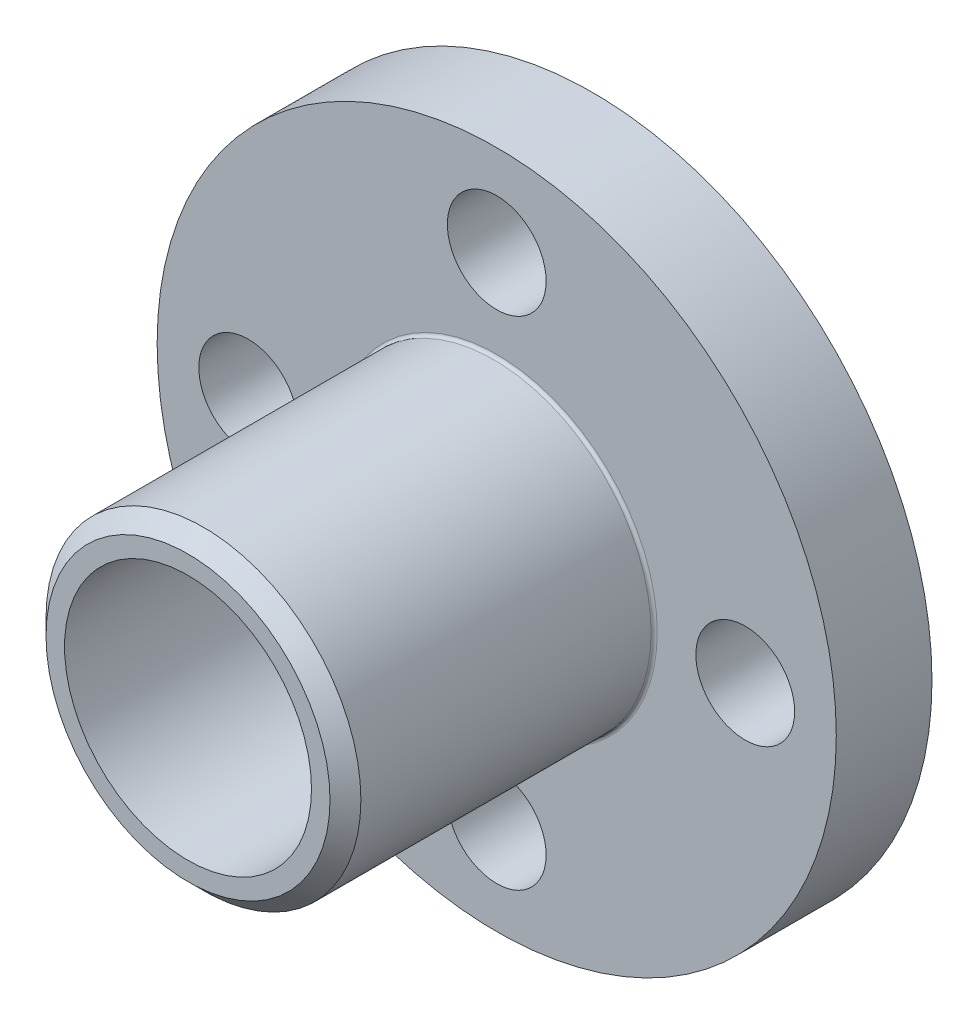
ISO-10303-21;
HEADER;
FILE_DESCRIPTION(('STEP AP214'),'2;1');
FILE_NAME('part.step','',(''),(''),'','','');
FILE_SCHEMA(('AUTOMOTIVE_DESIGN { 1 0 10303 214 1 1 1 1 }'));
ENDSEC;
DATA;
#1=APPLICATION_CONTEXT('core data for automotive mechanical design processes');
#2=APPLICATION_PROTOCOL_DEFINITION('international standard','automotive_design',2000,#1);
#3=PRODUCT_CONTEXT('',#1,'mechanical');
#4=PRODUCT('Part','Part','',(#3));
#5=PRODUCT_RELATED_PRODUCT_CATEGORY('part','',(#4));
#6=PRODUCT_DEFINITION_FORMATION('','',#4);
#7=PRODUCT_DEFINITION_CONTEXT('part definition',#1,'design');
#8=PRODUCT_DEFINITION('design','',#6,#7);
#9=PRODUCT_DEFINITION_SHAPE('','',#8);
#10=(LENGTH_UNIT() NAMED_UNIT(*) SI_UNIT(.MILLI.,.METRE.));
#11=(NAMED_UNIT(*) PLANE_ANGLE_UNIT() SI_UNIT($,.RADIAN.));
#12=(NAMED_UNIT(*) SI_UNIT($,.STERADIAN.) SOLID_ANGLE_UNIT());
#13=UNCERTAINTY_MEASURE_WITH_UNIT(LENGTH_MEASURE(1.E-05),#10,'distance_accuracy_value','');
#14=(GEOMETRIC_REPRESENTATION_CONTEXT(3) GLOBAL_UNCERTAINTY_ASSIGNED_CONTEXT((#13)) GLOBAL_UNIT_ASSIGNED_CONTEXT((#10,
#11,#12)) REPRESENTATION_CONTEXT('',''));
#15=CARTESIAN_POINT('',(0.,0.,0.));
#16=DIRECTION('',(0.,0.,1.));
#17=DIRECTION('',(1.,0.,0.));
#18=AXIS2_PLACEMENT_3D('',#15,#16,#17);
#19=CARTESIAN_POINT('',(0.,0.,3.1));
#20=DIRECTION('',(0.,0.,1.));
#21=DIRECTION('',(1.,0.,0.));
#22=AXIS2_PLACEMENT_3D('',#19,#20,#21);
#23=PLANE('',#22);
#24=CARTESIAN_POINT('',(0.,8.05,3.1));
#25=DIRECTION('',(0.,0.,1.));
#26=DIRECTION('',(1.,0.,0.));
#27=AXIS2_PLACEMENT_3D('',#24,#25,#26);
#28=CIRCLE('',#27,1.6);
#29=CARTESIAN_POINT('',(1.6,8.05,3.1));
#30=VERTEX_POINT('',#29);
#31=EDGE_CURVE('E51',#30,#30,#28,.T.);
#32=ORIENTED_EDGE('',*,*,#31,.F.);
#33=EDGE_LOOP('',(#32));
#34=FACE_BOUND('',#33,.T.);
#35=CARTESIAN_POINT('',(8.05,0.,3.1));
#36=DIRECTION('',(0.,0.,1.));
#37=DIRECTION('',(1.,0.,0.));
#38=AXIS2_PLACEMENT_3D('',#35,#36,#37);
#39=CIRCLE('',#38,1.6);
#40=CARTESIAN_POINT('',(9.65,0.,3.1));
#41=VERTEX_POINT('',#40);
#42=EDGE_CURVE('E158',#41,#41,#39,.T.);
#43=ORIENTED_EDGE('',*,*,#42,.F.);
#44=EDGE_LOOP('',(#43));
#45=FACE_BOUND('',#44,.T.);
#46=CARTESIAN_POINT('',(0.,-8.05,3.1));
#47=DIRECTION('',(0.,0.,1.));
#48=DIRECTION('',(1.,0.,0.));
#49=AXIS2_PLACEMENT_3D('',#46,#47,#48);
#50=CIRCLE('',#49,1.6);
#51=CARTESIAN_POINT('',(1.6,-8.05,3.1));
#52=VERTEX_POINT('',#51);
#53=EDGE_CURVE('E161',#52,#52,#50,.T.);
#54=ORIENTED_EDGE('',*,*,#53,.F.);
#55=EDGE_LOOP('',(#54));
#56=FACE_BOUND('',#55,.T.);
#57=CARTESIAN_POINT('',(-8.05,0.,3.1));
#58=DIRECTION('',(0.,0.,1.));
#59=DIRECTION('',(1.,0.,0.));
#60=AXIS2_PLACEMENT_3D('',#57,#58,#59);
#61=CIRCLE('',#60,1.6);
#62=CARTESIAN_POINT('',(-6.45,0.,3.1));
#63=VERTEX_POINT('',#62);
#64=EDGE_CURVE('E70',#63,#63,#61,.T.);
#65=ORIENTED_EDGE('',*,*,#64,.F.);
#66=EDGE_LOOP('',(#65));
#67=FACE_BOUND('',#66,.T.);
#68=CARTESIAN_POINT('',(0.,0.,3.1));
#69=DIRECTION('',(0.,0.,1.));
#70=DIRECTION('',(1.,0.,0.));
#71=AXIS2_PLACEMENT_3D('',#68,#69,#70);
#72=CIRCLE('',#71,5.2);
#73=CARTESIAN_POINT('',(5.2,0.,3.1));
#74=VERTEX_POINT('',#73);
#75=EDGE_CURVE('E10',#74,#74,#72,.F.);
#76=ORIENTED_EDGE('',*,*,#75,.T.);
#77=EDGE_LOOP('',(#76));
#78=FACE_BOUND('',#77,.T.);
#79=CARTESIAN_POINT('',(0.,0.,3.1));
#80=DIRECTION('',(0.,0.,1.));
#81=DIRECTION('',(1.,0.,0.));
#82=AXIS2_PLACEMENT_3D('',#79,#80,#81);
#83=CIRCLE('',#82,11.);
#84=CARTESIAN_POINT('',(-11.,0.,3.1));
#85=VERTEX_POINT('',#84);
#86=EDGE_CURVE('E73',#85,#85,#83,.T.);
#87=ORIENTED_EDGE('',*,*,#86,.T.);
#88=EDGE_LOOP('',(#87));
#89=FACE_BOUND('',#88,.T.);
#90=ADVANCED_FACE('F30',(#34,#45,#56,#67,#78,#89),#23,.T.);
#91=CARTESIAN_POINT('',(0.,0.,0.));
#92=DIRECTION('',(0.,0.,1.));
#93=DIRECTION('',(1.,0.,0.));
#94=AXIS2_PLACEMENT_3D('',#91,#92,#93);
#95=PLANE('',#94);
#96=CARTESIAN_POINT('',(0.,8.05,0.));
#97=DIRECTION('',(0.,0.,1.));
#98=DIRECTION('',(1.,0.,0.));
#99=AXIS2_PLACEMENT_3D('',#96,#97,#98);
#100=CIRCLE('',#99,1.6);
#101=CARTESIAN_POINT('',(1.6,8.05,0.));
#102=VERTEX_POINT('',#101);
#103=EDGE_CURVE('E34',#102,#102,#100,.T.);
#104=ORIENTED_EDGE('',*,*,#103,.T.);
#105=EDGE_LOOP('',(#104));
#106=FACE_BOUND('',#105,.T.);
#107=CARTESIAN_POINT('',(8.05,0.,0.));
#108=DIRECTION('',(0.,0.,1.));
#109=DIRECTION('',(1.,0.,0.));
#110=AXIS2_PLACEMENT_3D('',#107,#108,#109);
#111=CIRCLE('',#110,1.6);
#112=CARTESIAN_POINT('',(9.65,0.,0.));
#113=VERTEX_POINT('',#112);
#114=EDGE_CURVE('E53',#113,#113,#111,.T.);
#115=ORIENTED_EDGE('',*,*,#114,.T.);
#116=EDGE_LOOP('',(#115));
#117=FACE_BOUND('',#116,.T.);
#118=CARTESIAN_POINT('',(0.,-8.05,0.));
#119=DIRECTION('',(0.,0.,1.));
#120=DIRECTION('',(1.,0.,0.));
#121=AXIS2_PLACEMENT_3D('',#118,#119,#120);
#122=CIRCLE('',#121,1.6);
#123=CARTESIAN_POINT('',(1.6,-8.05,0.));
#124=VERTEX_POINT('',#123);
#125=EDGE_CURVE('E50',#124,#124,#122,.T.);
#126=ORIENTED_EDGE('',*,*,#125,.T.);
#127=EDGE_LOOP('',(#126));
#128=FACE_BOUND('',#127,.T.);
#129=CARTESIAN_POINT('',(-8.05,0.,0.));
#130=DIRECTION('',(0.,0.,1.));
#131=DIRECTION('',(1.,0.,0.));
#132=AXIS2_PLACEMENT_3D('',#129,#130,#131);
#133=CIRCLE('',#132,1.6);
#134=CARTESIAN_POINT('',(-6.45,0.,0.));
#135=VERTEX_POINT('',#134);
#136=EDGE_CURVE('E47',#135,#135,#133,.T.);
#137=ORIENTED_EDGE('',*,*,#136,.T.);
#138=EDGE_LOOP('',(#137));
#139=FACE_BOUND('',#138,.T.);
#140=CARTESIAN_POINT('',(0.,0.,0.));
#141=DIRECTION('',(0.,0.,1.));
#142=DIRECTION('',(1.,0.,0.));
#143=AXIS2_PLACEMENT_3D('',#140,#141,#142);
#144=CIRCLE('',#143,11.);
#145=CARTESIAN_POINT('',(-11.,0.,0.));
#146=VERTEX_POINT('',#145);
#147=EDGE_CURVE('E67',#146,#146,#144,.T.);
#148=ORIENTED_EDGE('',*,*,#147,.F.);
#149=EDGE_LOOP('',(#148));
#150=FACE_BOUND('',#149,.T.);
#151=CARTESIAN_POINT('',(0.,0.,0.));
#152=DIRECTION('',(0.,0.,1.));
#153=DIRECTION('',(1.,0.,0.));
#154=AXIS2_PLACEMENT_3D('',#151,#152,#153);
#155=CIRCLE('',#154,4.);
#156=CARTESIAN_POINT('',(4.,0.,0.));
#157=VERTEX_POINT('',#156);
#158=EDGE_CURVE('E62',#157,#157,#155,.T.);
#159=ORIENTED_EDGE('',*,*,#158,.T.);
#160=EDGE_LOOP('',(#159));
#161=FACE_BOUND('',#160,.T.);
#162=ADVANCED_FACE('F102',(#106,#117,#128,#139,#150,#161),#95,.F.);
#163=CARTESIAN_POINT('',(0.,0.,3.1));
#164=DIRECTION('',(0.,0.,-1.));
#165=DIRECTION('',(-1.,0.,0.));
#166=AXIS2_PLACEMENT_3D('',#163,#164,#165);
#167=CYLINDRICAL_SURFACE('',#166,11.);
#168=CARTESIAN_POINT('',(-11.,0.,3.1));
#169=CARTESIAN_POINT('',(-11.,0.,3.06770833333333));
#170=CARTESIAN_POINT('',(-11.,0.,3.03541666666667));
#171=CARTESIAN_POINT('',(-11.,0.,2.97083333333333));
#172=CARTESIAN_POINT('',(-11.,0.,2.93854166666667));
#173=CARTESIAN_POINT('',(-11.,0.,2.87395833333333));
#174=CARTESIAN_POINT('',(-11.,0.,2.84166666666667));
#175=CARTESIAN_POINT('',(-11.,0.,2.77708333333333));
#176=CARTESIAN_POINT('',(-11.,0.,2.74479166666667));
#177=CARTESIAN_POINT('',(-11.,0.,2.68020833333333));
#178=CARTESIAN_POINT('',(-11.,0.,2.64791666666667));
#179=CARTESIAN_POINT('',(-11.,0.,2.58333333333333));
#180=CARTESIAN_POINT('',(-11.,0.,2.55104166666667));
#181=CARTESIAN_POINT('',(-11.,0.,2.48645833333333));
#182=CARTESIAN_POINT('',(-11.,0.,2.45416666666667));
#183=CARTESIAN_POINT('',(-11.,0.,2.38958333333333));
#184=CARTESIAN_POINT('',(-11.,0.,2.35729166666667));
#185=CARTESIAN_POINT('',(-11.,0.,2.29270833333333));
#186=CARTESIAN_POINT('',(-11.,0.,2.26041666666667));
#187=CARTESIAN_POINT('',(-11.,0.,2.19583333333333));
#188=CARTESIAN_POINT('',(-11.,0.,2.16354166666667));
#189=CARTESIAN_POINT('',(-11.,0.,2.09895833333333));
#190=CARTESIAN_POINT('',(-11.,0.,2.06666666666667));
#191=CARTESIAN_POINT('',(-11.,0.,2.00208333333333));
#192=CARTESIAN_POINT('',(-11.,0.,1.96979166666667));
#193=CARTESIAN_POINT('',(-11.,0.,1.90520833333333));
#194=CARTESIAN_POINT('',(-11.,0.,1.87291666666667));
#195=CARTESIAN_POINT('',(-11.,0.,1.80833333333333));
#196=CARTESIAN_POINT('',(-11.,0.,1.77604166666667));
#197=CARTESIAN_POINT('',(-11.,0.,1.71145833333333));
#198=CARTESIAN_POINT('',(-11.,0.,1.67916666666667));
#199=CARTESIAN_POINT('',(-11.,0.,1.61458333333333));
#200=CARTESIAN_POINT('',(-11.,0.,1.58229166666667));
#201=CARTESIAN_POINT('',(-11.,0.,1.51770833333333));
#202=CARTESIAN_POINT('',(-11.,0.,1.48541666666667));
#203=CARTESIAN_POINT('',(-11.,0.,1.42083333333333));
#204=CARTESIAN_POINT('',(-11.,0.,1.38854166666667));
#205=CARTESIAN_POINT('',(-11.,0.,1.32395833333333));
#206=CARTESIAN_POINT('',(-11.,0.,1.29166666666667));
#207=CARTESIAN_POINT('',(-11.,0.,1.22708333333333));
#208=CARTESIAN_POINT('',(-11.,0.,1.19479166666667));
#209=CARTESIAN_POINT('',(-11.,0.,1.13020833333333));
#210=CARTESIAN_POINT('',(-11.,0.,1.09791666666667));
#211=CARTESIAN_POINT('',(-11.,0.,1.03333333333333));
#212=CARTESIAN_POINT('',(-11.,0.,1.00104166666667));
#213=CARTESIAN_POINT('',(-11.,0.,0.936458333333333));
#214=CARTESIAN_POINT('',(-11.,0.,0.904166666666667));
#215=CARTESIAN_POINT('',(-11.,0.,0.839583333333334));
#216=CARTESIAN_POINT('',(-11.,0.,0.807291666666667));
#217=CARTESIAN_POINT('',(-11.,0.,0.742708333333333));
#218=CARTESIAN_POINT('',(-11.,0.,0.710416666666667));
#219=CARTESIAN_POINT('',(-11.,0.,0.645833333333333));
#220=CARTESIAN_POINT('',(-11.,0.,0.613541666666667));
#221=CARTESIAN_POINT('',(-11.,0.,0.548958333333333));
#222=CARTESIAN_POINT('',(-11.,0.,0.516666666666667));
#223=CARTESIAN_POINT('',(-11.,0.,0.452083333333333));
#224=CARTESIAN_POINT('',(-11.,0.,0.419791666666667));
#225=CARTESIAN_POINT('',(-11.,0.,0.355208333333333));
#226=CARTESIAN_POINT('',(-11.,0.,0.322916666666667));
#227=CARTESIAN_POINT('',(-11.,0.,0.258333333333333));
#228=CARTESIAN_POINT('',(-11.,0.,0.226041666666667));
#229=CARTESIAN_POINT('',(-11.,0.,0.161458333333333));
#230=CARTESIAN_POINT('',(-11.,0.,0.129166666666667));
#231=CARTESIAN_POINT('',(-11.,0.,0.0645833333333335));
#232=CARTESIAN_POINT('',(-11.,0.,0.0322916666666667));
#233=CARTESIAN_POINT('',(-11.,0.,0.));
#234=B_SPLINE_CURVE_WITH_KNOTS('',3,(#168,#169,#170,#171,#172,#173,#174,#175,#176,#177,#178,
#179,#180,#181,#182,#183,#184,#185,#186,#187,#188,#189,#190,#191,#192,#193,#194,#195,#196,#197,
#198,#199,#200,#201,#202,#203,#204,#205,#206,#207,#208,#209,#210,#211,#212,#213,#214,#215,#216,
#217,#218,#219,#220,#221,#222,#223,#224,#225,#226,#227,#228,#229,#230,#231,#232,#233),
.UNSPECIFIED.,.F.,.F.,(4,2,2,2,2,2,2,2,2,2,2,2,2,2,2,2,2,2,2,2,2,2,2,2,2,2,2,2,2,2,2,2,4),(0.,
0.0968750000000002,0.19375,0.290625,0.3875,0.484375,0.58125,0.678125,0.775,0.871875,0.96875,
1.065625,1.1625,1.259375,1.35625,1.453125,1.55,1.646875,1.74375,1.840625,1.9375,2.034375,
2.13125,2.228125,2.325,2.421875,2.51875,2.615625,2.7125,2.809375,2.90625,3.003125,3.1),.UNSPECIFIED.);
#235=EDGE_CURVE('BSEAM108',#85,#146,#234,.T.);
#236=ORIENTED_EDGE('',*,*,#86,.F.);
#237=ORIENTED_EDGE('',*,*,#147,.T.);
#238=ORIENTED_EDGE('',*,*,#235,.T.);
#239=ORIENTED_EDGE('',*,*,#235,.F.);
#240=EDGE_LOOP('',(#236,#238,#237,#239));
#241=FACE_BOUND('',#240,.T.);
#242=ADVANCED_FACE('F108',(#241),#167,.T.);
#243=CARTESIAN_POINT('',(0.,0.,0.));
#244=DIRECTION('',(0.,0.,1.));
#245=DIRECTION('',(1.,0.,0.));
#246=AXIS2_PLACEMENT_3D('',#243,#244,#245);
#247=CYLINDRICAL_SURFACE('',#246,5.1);
#248=CARTESIAN_POINT('',(0.,0.,3.2));
#249=DIRECTION('',(0.,0.,1.));
#250=DIRECTION('',(1.,0.,0.));
#251=AXIS2_PLACEMENT_3D('',#248,#249,#250);
#252=CIRCLE('',#251,5.1);
#253=CARTESIAN_POINT('',(5.1,0.,3.2));
#254=VERTEX_POINT('',#253);
#255=EDGE_CURVE('E38',#254,#254,#252,.T.);
#256=CARTESIAN_POINT('',(0.,0.,12.6));
#257=DIRECTION('',(0.,0.,1.));
#258=DIRECTION('',(1.,0.,0.));
#259=AXIS2_PLACEMENT_3D('',#256,#257,#258);
#260=CIRCLE('',#259,5.1);
#261=CARTESIAN_POINT('',(5.1,0.,12.6));
#262=VERTEX_POINT('',#261);
#263=EDGE_CURVE('E43',#262,#262,#260,.F.);
#264=CARTESIAN_POINT('',(5.1,0.,3.2));
#265=CARTESIAN_POINT('',(5.1,0.,3.29791666666667));
#266=CARTESIAN_POINT('',(5.1,0.,3.39583333333333));
#267=CARTESIAN_POINT('',(5.1,0.,3.59166666666667));
#268=CARTESIAN_POINT('',(5.1,0.,3.68958333333333));
#269=CARTESIAN_POINT('',(5.1,0.,3.88541666666667));
#270=CARTESIAN_POINT('',(5.1,0.,3.98333333333333));
#271=CARTESIAN_POINT('',(5.1,0.,4.17916666666667));
#272=CARTESIAN_POINT('',(5.1,0.,4.27708333333333));
#273=CARTESIAN_POINT('',(5.1,0.,4.47291666666667));
#274=CARTESIAN_POINT('',(5.1,0.,4.57083333333333));
#275=CARTESIAN_POINT('',(5.1,0.,4.76666666666667));
#276=CARTESIAN_POINT('',(5.1,0.,4.86458333333333));
#277=CARTESIAN_POINT('',(5.1,0.,5.06041666666667));
#278=CARTESIAN_POINT('',(5.1,0.,5.15833333333333));
#279=CARTESIAN_POINT('',(5.1,0.,5.35416666666667));
#280=CARTESIAN_POINT('',(5.1,0.,5.45208333333333));
#281=CARTESIAN_POINT('',(5.1,0.,5.64791666666667));
#282=CARTESIAN_POINT('',(5.1,0.,5.74583333333333));
#283=CARTESIAN_POINT('',(5.1,0.,5.94166666666667));
#284=CARTESIAN_POINT('',(5.1,0.,6.03958333333333));
#285=CARTESIAN_POINT('',(5.1,0.,6.23541666666667));
#286=CARTESIAN_POINT('',(5.1,0.,6.33333333333333));
#287=CARTESIAN_POINT('',(5.1,0.,6.52916666666667));
#288=CARTESIAN_POINT('',(5.1,0.,6.62708333333333));
#289=CARTESIAN_POINT('',(5.1,0.,6.82291666666667));
#290=CARTESIAN_POINT('',(5.1,0.,6.92083333333334));
#291=CARTESIAN_POINT('',(5.1,0.,7.11666666666667));
#292=CARTESIAN_POINT('',(5.1,0.,7.21458333333334));
#293=CARTESIAN_POINT('',(5.1,0.,7.41041666666667));
#294=CARTESIAN_POINT('',(5.1,0.,7.50833333333334));
#295=CARTESIAN_POINT('',(5.1,0.,7.70416666666667));
#296=CARTESIAN_POINT('',(5.1,0.,7.80208333333334));
#297=CARTESIAN_POINT('',(5.1,0.,7.99791666666667));
#298=CARTESIAN_POINT('',(5.1,0.,8.09583333333333));
#299=CARTESIAN_POINT('',(5.1,0.,8.29166666666667));
#300=CARTESIAN_POINT('',(5.1,0.,8.38958333333334));
#301=CARTESIAN_POINT('',(5.1,0.,8.58541666666667));
#302=CARTESIAN_POINT('',(5.1,0.,8.68333333333334));
#303=CARTESIAN_POINT('',(5.1,0.,8.87916666666667));
#304=CARTESIAN_POINT('',(5.1,0.,8.97708333333333));
#305=CARTESIAN_POINT('',(5.1,0.,9.17291666666667));
#306=CARTESIAN_POINT('',(5.1,0.,9.27083333333334));
#307=CARTESIAN_POINT('',(5.1,0.,9.46666666666667));
#308=CARTESIAN_POINT('',(5.1,0.,9.56458333333334));
#309=CARTESIAN_POINT('',(5.1,0.,9.76041666666667));
#310=CARTESIAN_POINT('',(5.1,0.,9.85833333333334));
#311=CARTESIAN_POINT('',(5.1,0.,10.0541666666667));
#312=CARTESIAN_POINT('',(5.1,0.,10.1520833333333));
#313=CARTESIAN_POINT('',(5.1,0.,10.3479166666667));
#314=CARTESIAN_POINT('',(5.1,0.,10.4458333333333));
#315=CARTESIAN_POINT('',(5.1,0.,10.6416666666667));
#316=CARTESIAN_POINT('',(5.1,0.,10.7395833333333));
#317=CARTESIAN_POINT('',(5.1,0.,10.9354166666667));
#318=CARTESIAN_POINT('',(5.1,0.,11.0333333333333));
#319=CARTESIAN_POINT('',(5.1,0.,11.2291666666667));
#320=CARTESIAN_POINT('',(5.1,0.,11.3270833333333));
#321=CARTESIAN_POINT('',(5.1,0.,11.5229166666667));
#322=CARTESIAN_POINT('',(5.1,0.,11.6208333333333));
#323=CARTESIAN_POINT('',(5.1,0.,11.8166666666667));
#324=CARTESIAN_POINT('',(5.1,0.,11.9145833333333));
#325=CARTESIAN_POINT('',(5.1,0.,12.1104166666667));
#326=CARTESIAN_POINT('',(5.1,0.,12.2083333333333));
#327=CARTESIAN_POINT('',(5.1,0.,12.4041666666667));
#328=CARTESIAN_POINT('',(5.1,0.,12.5020833333333));
#329=CARTESIAN_POINT('',(5.1,0.,12.6));
#330=B_SPLINE_CURVE_WITH_KNOTS('',3,(#264,#265,#266,#267,#268,#269,#270,#271,#272,#273,#274,
#275,#276,#277,#278,#279,#280,#281,#282,#283,#284,#285,#286,#287,#288,#289,#290,#291,#292,#293,
#294,#295,#296,#297,#298,#299,#300,#301,#302,#303,#304,#305,#306,#307,#308,#309,#310,#311,#312,
#313,#314,#315,#316,#317,#318,#319,#320,#321,#322,#323,#324,#325,#326,#327,#328,#329),
.UNSPECIFIED.,.F.,.F.,(4,2,2,2,2,2,2,2,2,2,2,2,2,2,2,2,2,2,2,2,2,2,2,2,2,2,2,2,2,2,2,2,4),(0.,
0.29375,0.5875,0.881250000000001,1.175,1.46875,1.7625,2.05625,2.35,2.64375,2.9375,3.23125,3.525,
3.81875,4.1125,4.40625,4.7,4.99375,5.2875,5.58125,5.875,6.16875,6.4625,6.75625,7.05000000000001,
7.34375,7.63750000000001,7.93125,8.225,8.51875000000001,8.8125,9.10625,9.40000000000001),.UNSPECIFIED.);
#331=EDGE_CURVE('BSEAM83',#254,#262,#330,.T.);
#332=ORIENTED_EDGE('',*,*,#255,.T.);
#333=ORIENTED_EDGE('',*,*,#263,.T.);
#334=ORIENTED_EDGE('',*,*,#331,.T.);
#335=ORIENTED_EDGE('',*,*,#331,.F.);
#336=EDGE_LOOP('',(#332,#334,#333,#335));
#337=FACE_BOUND('',#336,.T.);
#338=ADVANCED_FACE('F83',(#337),#247,.T.);
#339=CARTESIAN_POINT('',(0.,0.,0.));
#340=DIRECTION('',(0.,0.,1.));
#341=DIRECTION('',(1.,0.,0.));
#342=AXIS2_PLACEMENT_3D('',#339,#340,#341);
#343=CYLINDRICAL_SURFACE('',#342,4.);
#344=CARTESIAN_POINT('',(0.,0.,13.1));
#345=DIRECTION('',(0.,0.,1.));
#346=DIRECTION('',(1.,0.,0.));
#347=AXIS2_PLACEMENT_3D('',#344,#345,#346);
#348=CIRCLE('',#347,4.);
#349=CARTESIAN_POINT('',(4.,0.,13.1));
#350=VERTEX_POINT('',#349);
#351=EDGE_CURVE('E58',#350,#350,#348,.T.);
#352=CARTESIAN_POINT('',(4.,0.,0.));
#353=CARTESIAN_POINT('',(4.,0.,0.136458333333333));
#354=CARTESIAN_POINT('',(4.,0.,0.272916666666667));
#355=CARTESIAN_POINT('',(4.,0.,0.545833333333333));
#356=CARTESIAN_POINT('',(4.,0.,0.682291666666667));
#357=CARTESIAN_POINT('',(4.,0.,0.955208333333333));
#358=CARTESIAN_POINT('',(4.,0.,1.09166666666667));
#359=CARTESIAN_POINT('',(4.,0.,1.36458333333333));
#360=CARTESIAN_POINT('',(4.,0.,1.50104166666667));
#361=CARTESIAN_POINT('',(4.,0.,1.77395833333333));
#362=CARTESIAN_POINT('',(4.,0.,1.91041666666667));
#363=CARTESIAN_POINT('',(4.,0.,2.18333333333333));
#364=CARTESIAN_POINT('',(4.,0.,2.31979166666667));
#365=CARTESIAN_POINT('',(4.,0.,2.59270833333333));
#366=CARTESIAN_POINT('',(4.,0.,2.72916666666667));
#367=CARTESIAN_POINT('',(4.,0.,3.00208333333333));
#368=CARTESIAN_POINT('',(4.,0.,3.13854166666667));
#369=CARTESIAN_POINT('',(4.,0.,3.41145833333333));
#370=CARTESIAN_POINT('',(4.,0.,3.54791666666667));
#371=CARTESIAN_POINT('',(4.,0.,3.82083333333333));
#372=CARTESIAN_POINT('',(4.,0.,3.95729166666667));
#373=CARTESIAN_POINT('',(4.,0.,4.23020833333333));
#374=CARTESIAN_POINT('',(4.,0.,4.36666666666667));
#375=CARTESIAN_POINT('',(4.,0.,4.63958333333333));
#376=CARTESIAN_POINT('',(4.,0.,4.77604166666667));
#377=CARTESIAN_POINT('',(4.,0.,5.04895833333333));
#378=CARTESIAN_POINT('',(4.,0.,5.18541666666667));
#379=CARTESIAN_POINT('',(4.,0.,5.45833333333333));
#380=CARTESIAN_POINT('',(4.,0.,5.59479166666667));
#381=CARTESIAN_POINT('',(4.,0.,5.86770833333333));
#382=CARTESIAN_POINT('',(4.,0.,6.00416666666667));
#383=CARTESIAN_POINT('',(4.,0.,6.27708333333333));
#384=CARTESIAN_POINT('',(4.,0.,6.41354166666667));
#385=CARTESIAN_POINT('',(4.,0.,6.68645833333333));
#386=CARTESIAN_POINT('',(4.,0.,6.82291666666667));
#387=CARTESIAN_POINT('',(4.,0.,7.09583333333333));
#388=CARTESIAN_POINT('',(4.,0.,7.23229166666667));
#389=CARTESIAN_POINT('',(4.,0.,7.50520833333333));
#390=CARTESIAN_POINT('',(4.,0.,7.64166666666667));
#391=CARTESIAN_POINT('',(4.,0.,7.91458333333333));
#392=CARTESIAN_POINT('',(4.,0.,8.05104166666666));
#393=CARTESIAN_POINT('',(4.,0.,8.32395833333333));
#394=CARTESIAN_POINT('',(4.,0.,8.46041666666667));
#395=CARTESIAN_POINT('',(4.,0.,8.73333333333333));
#396=CARTESIAN_POINT('',(4.,0.,8.86979166666666));
#397=CARTESIAN_POINT('',(4.,0.,9.14270833333333));
#398=CARTESIAN_POINT('',(4.,0.,9.27916666666667));
#399=CARTESIAN_POINT('',(4.,0.,9.55208333333333));
#400=CARTESIAN_POINT('',(4.,0.,9.68854166666666));
#401=CARTESIAN_POINT('',(4.,0.,9.96145833333333));
#402=CARTESIAN_POINT('',(4.,0.,10.0979166666667));
#403=CARTESIAN_POINT('',(4.,0.,10.3708333333333));
#404=CARTESIAN_POINT('',(4.,0.,10.5072916666667));
#405=CARTESIAN_POINT('',(4.,0.,10.7802083333333));
#406=CARTESIAN_POINT('',(4.,0.,10.9166666666667));
#407=CARTESIAN_POINT('',(4.,0.,11.1895833333333));
#408=CARTESIAN_POINT('',(4.,0.,11.3260416666667));
#409=CARTESIAN_POINT('',(4.,0.,11.5989583333333));
#410=CARTESIAN_POINT('',(4.,0.,11.7354166666667));
#411=CARTESIAN_POINT('',(4.,0.,12.0083333333333));
#412=CARTESIAN_POINT('',(4.,0.,12.1447916666667));
#413=CARTESIAN_POINT('',(4.,0.,12.4177083333333));
#414=CARTESIAN_POINT('',(4.,0.,12.5541666666667));
#415=CARTESIAN_POINT('',(4.,0.,12.8270833333333));
#416=CARTESIAN_POINT('',(4.,0.,12.9635416666667));
#417=CARTESIAN_POINT('',(4.,0.,13.1));
#418=B_SPLINE_CURVE_WITH_KNOTS('',3,(#352,#353,#354,#355,#356,#357,#358,#359,#360,#361,#362,
#363,#364,#365,#366,#367,#368,#369,#370,#371,#372,#373,#374,#375,#376,#377,#378,#379,#380,#381,
#382,#383,#384,#385,#386,#387,#388,#389,#390,#391,#392,#393,#394,#395,#396,#397,#398,#399,#400,
#401,#402,#403,#404,#405,#406,#407,#408,#409,#410,#411,#412,#413,#414,#415,#416,#417),
.UNSPECIFIED.,.F.,.F.,(4,2,2,2,2,2,2,2,2,2,2,2,2,2,2,2,2,2,2,2,2,2,2,2,2,2,2,2,2,2,2,2,4),(0.,
0.409375,0.81875,1.228125,1.6375,2.046875,2.45625,2.865625,3.275,3.684375,4.09375,4.503125,
4.9125,5.321875,5.73125,6.140625,6.55,6.959375,7.36875,7.778125,8.1875,8.596875,9.00625,
9.415625,9.825,10.234375,10.64375,11.053125,11.4625,11.871875,12.28125,12.690625,13.1),.UNSPECIFIED.);
#419=EDGE_CURVE('BSEAM93',#157,#350,#418,.T.);
#420=ORIENTED_EDGE('',*,*,#158,.F.);
#421=ORIENTED_EDGE('',*,*,#351,.T.);
#422=ORIENTED_EDGE('',*,*,#419,.T.);
#423=ORIENTED_EDGE('',*,*,#419,.F.);
#424=EDGE_LOOP('',(#420,#422,#421,#423));
#425=FACE_BOUND('',#424,.T.);
#426=ADVANCED_FACE('F93',(#425),#343,.F.);
#427=CARTESIAN_POINT('',(0.,0.,13.1));
#428=DIRECTION('',(0.,0.,1.));
#429=DIRECTION('',(1.,0.,0.));
#430=AXIS2_PLACEMENT_3D('',#427,#428,#429);
#431=PLANE('',#430);
#432=CARTESIAN_POINT('',(0.,0.,13.1));
#433=DIRECTION('',(0.,0.,1.));
#434=DIRECTION('',(1.,0.,0.));
#435=AXIS2_PLACEMENT_3D('',#432,#433,#434);
#436=CIRCLE('',#435,4.60000000000001);
#437=CARTESIAN_POINT('',(4.60000000000001,0.,13.1));
#438=VERTEX_POINT('',#437);
#439=EDGE_CURVE('E76',#438,#438,#436,.T.);
#440=ORIENTED_EDGE('',*,*,#439,.T.);
#441=EDGE_LOOP('',(#440));
#442=FACE_BOUND('',#441,.T.);
#443=ORIENTED_EDGE('',*,*,#351,.F.);
#444=EDGE_LOOP('',(#443));
#445=FACE_BOUND('',#444,.T.);
#446=ADVANCED_FACE('F88',(#442,#445),#431,.T.);
#447=CARTESIAN_POINT('',(0.,0.,13.1));
#448=DIRECTION('',(0.,0.,-1.));
#449=DIRECTION('',(-1.,0.,0.));
#450=AXIS2_PLACEMENT_3D('',#447,#448,#449);
#451=CONICAL_SURFACE('',#450,4.60000000000001,0.785398163397447);
#452=ORIENTED_EDGE('',*,*,#263,.F.);
#453=EDGE_LOOP('',(#452));
#454=FACE_BOUND('',#453,.T.);
#455=ORIENTED_EDGE('',*,*,#439,.F.);
#456=EDGE_LOOP('',(#455));
#457=FACE_BOUND('',#456,.T.);
#458=ADVANCED_FACE('F85',(#454,#457),#451,.T.);
#459=CARTESIAN_POINT('',(0.,0.,3.2));
#460=DIRECTION('',(0.,0.,1.));
#461=DIRECTION('',(1.,0.,0.));
#462=AXIS2_PLACEMENT_3D('',#459,#460,#461);
#463=TOROIDAL_SURFACE('',#462,5.2,0.1);
#464=ORIENTED_EDGE('',*,*,#75,.F.);
#465=EDGE_LOOP('',(#464));
#466=FACE_BOUND('',#465,.T.);
#467=ORIENTED_EDGE('',*,*,#255,.F.);
#468=EDGE_LOOP('',(#467));
#469=FACE_BOUND('',#468,.T.);
#470=ADVANCED_FACE('F32',(#466,#469),#463,.F.);
#471=CARTESIAN_POINT('',(-8.05,0.,-6.9));
#472=DIRECTION('',(0.,0.,1.));
#473=DIRECTION('',(1.,0.,0.));
#474=AXIS2_PLACEMENT_3D('',#471,#472,#473);
#475=CYLINDRICAL_SURFACE('',#474,1.6);
#476=ORIENTED_EDGE('',*,*,#64,.T.);
#477=EDGE_LOOP('',(#476));
#478=FACE_BOUND('',#477,.T.);
#479=ORIENTED_EDGE('',*,*,#136,.F.);
#480=EDGE_LOOP('',(#479));
#481=FACE_BOUND('',#480,.T.);
#482=ADVANCED_FACE('F132',(#478,#481),#475,.F.);
#483=CARTESIAN_POINT('',(0.,-8.05,-6.9));
#484=DIRECTION('',(0.,0.,1.));
#485=DIRECTION('',(1.,0.,0.));
#486=AXIS2_PLACEMENT_3D('',#483,#484,#485);
#487=CYLINDRICAL_SURFACE('',#486,1.6);
#488=ORIENTED_EDGE('',*,*,#53,.T.);
#489=EDGE_LOOP('',(#488));
#490=FACE_BOUND('',#489,.T.);
#491=ORIENTED_EDGE('',*,*,#125,.F.);
#492=EDGE_LOOP('',(#491));
#493=FACE_BOUND('',#492,.T.);
#494=ADVANCED_FACE('F137',(#490,#493),#487,.F.);
#495=CARTESIAN_POINT('',(8.05,0.,-6.9));
#496=DIRECTION('',(0.,0.,1.));
#497=DIRECTION('',(1.,0.,0.));
#498=AXIS2_PLACEMENT_3D('',#495,#496,#497);
#499=CYLINDRICAL_SURFACE('',#498,1.6);
#500=ORIENTED_EDGE('',*,*,#42,.T.);
#501=EDGE_LOOP('',(#500));
#502=FACE_BOUND('',#501,.T.);
#503=ORIENTED_EDGE('',*,*,#114,.F.);
#504=EDGE_LOOP('',(#503));
#505=FACE_BOUND('',#504,.T.);
#506=ADVANCED_FACE('F142',(#502,#505),#499,.F.);
#507=CARTESIAN_POINT('',(0.,8.05,-6.9));
#508=DIRECTION('',(0.,0.,1.));
#509=DIRECTION('',(1.,0.,0.));
#510=AXIS2_PLACEMENT_3D('',#507,#508,#509);
#511=CYLINDRICAL_SURFACE('',#510,1.6);
#512=ORIENTED_EDGE('',*,*,#31,.T.);
#513=EDGE_LOOP('',(#512));
#514=FACE_BOUND('',#513,.T.);
#515=ORIENTED_EDGE('',*,*,#103,.F.);
#516=EDGE_LOOP('',(#515));
#517=FACE_BOUND('',#516,.T.);
#518=ADVANCED_FACE('F150',(#514,#517),#511,.F.);
#519=CLOSED_SHELL('',(#90,#162,#242,#338,#426,#446,#458,#470,#482,#494,#506,#518));
#520=MANIFOLD_SOLID_BREP('B2',#519);
#521=ADVANCED_BREP_SHAPE_REPRESENTATION('',(#18,#520),#14);
#522=SHAPE_DEFINITION_REPRESENTATION(#9,#521);
ENDSEC;
END-ISO-10303-21;
